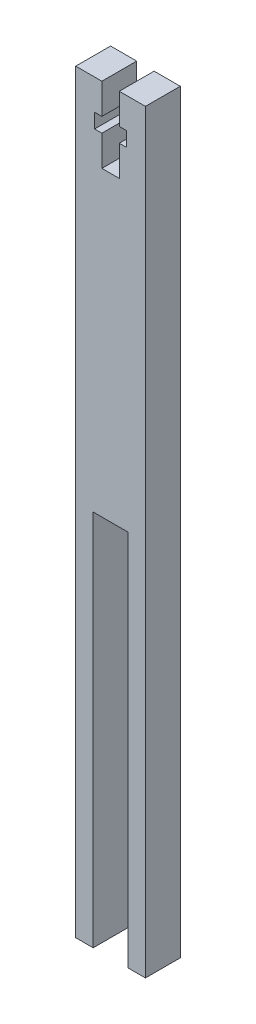
ISO-10303-21;
HEADER;
FILE_DESCRIPTION(('STEP AP214'),'2;1');
FILE_NAME('part.step','',(''),(''),'','','');
FILE_SCHEMA(('AUTOMOTIVE_DESIGN { 1 0 10303 214 1 1 1 1 }'));
ENDSEC;
DATA;
#1=APPLICATION_CONTEXT('core data for automotive mechanical design processes');
#2=APPLICATION_PROTOCOL_DEFINITION('international standard','automotive_design',2000,#1);
#3=PRODUCT_CONTEXT('',#1,'mechanical');
#4=PRODUCT('Part','Part','',(#3));
#5=PRODUCT_RELATED_PRODUCT_CATEGORY('part','',(#4));
#6=PRODUCT_DEFINITION_FORMATION('','',#4);
#7=PRODUCT_DEFINITION_CONTEXT('part definition',#1,'design');
#8=PRODUCT_DEFINITION('design','',#6,#7);
#9=PRODUCT_DEFINITION_SHAPE('','',#8);
#10=(LENGTH_UNIT() NAMED_UNIT(*) SI_UNIT(.MILLI.,.METRE.));
#11=(NAMED_UNIT(*) PLANE_ANGLE_UNIT() SI_UNIT($,.RADIAN.));
#12=(NAMED_UNIT(*) SI_UNIT($,.STERADIAN.) SOLID_ANGLE_UNIT());
#13=UNCERTAINTY_MEASURE_WITH_UNIT(LENGTH_MEASURE(1.E-05),#10,'distance_accuracy_value','');
#14=(GEOMETRIC_REPRESENTATION_CONTEXT(3) GLOBAL_UNCERTAINTY_ASSIGNED_CONTEXT((#13)) GLOBAL_UNIT_ASSIGNED_CONTEXT((#10,
#11,#12)) REPRESENTATION_CONTEXT('',''));
#15=CARTESIAN_POINT('',(0.,0.,0.));
#16=DIRECTION('',(0.,0.,1.));
#17=DIRECTION('',(1.,0.,0.));
#18=AXIS2_PLACEMENT_3D('',#15,#16,#17);
#19=CARTESIAN_POINT('',(-1.5,130.,6.));
#20=DIRECTION('',(0.,-1.,0.));
#21=DIRECTION('',(1.,0.,0.));
#22=AXIS2_PLACEMENT_3D('',#19,#20,#21);
#23=PLANE('',#22);
#24=DIRECTION('',(-1.,0.,0.));
#25=VECTOR('',#24,1.);
#26=CARTESIAN_POINT('',(-1.5,130.,0.));
#27=LINE('',#26,#25);
#28=CARTESIAN_POINT('',(-1.5,130.,0.));
#29=VERTEX_POINT('',#28);
#30=CARTESIAN_POINT('',(-6.00000000000001,130.,0.));
#31=VERTEX_POINT('',#30);
#32=EDGE_CURVE('E212',#29,#31,#27,.T.);
#33=ORIENTED_EDGE('',*,*,#32,.T.);
#34=DIRECTION('',(0.,0.,-1.));
#35=VECTOR('',#34,1.);
#36=CARTESIAN_POINT('',(-6.00000000000001,130.,6.));
#37=LINE('',#36,#35);
#38=CARTESIAN_POINT('',(-6.00000000000001,130.,6.));
#39=VERTEX_POINT('',#38);
#40=EDGE_CURVE('E11',#39,#31,#37,.T.);
#41=ORIENTED_EDGE('',*,*,#40,.F.);
#42=DIRECTION('',(-1.,0.,0.));
#43=VECTOR('',#42,1.);
#44=CARTESIAN_POINT('',(-1.5,130.,6.));
#45=LINE('',#44,#43);
#46=CARTESIAN_POINT('',(-1.5,130.,6.));
#47=VERTEX_POINT('',#46);
#48=EDGE_CURVE('E270',#47,#39,#45,.T.);
#49=ORIENTED_EDGE('',*,*,#48,.F.);
#50=DIRECTION('',(0.,0.,-1.));
#51=VECTOR('',#50,1.);
#52=CARTESIAN_POINT('',(-1.5,130.,6.));
#53=LINE('',#52,#51);
#54=EDGE_CURVE('E208',#47,#29,#53,.T.);
#55=ORIENTED_EDGE('',*,*,#54,.T.);
#56=EDGE_LOOP('',(#33,#41,#49,#55));
#57=FACE_BOUND('',#56,.T.);
#58=ADVANCED_FACE('F39',(#57),#23,.F.);
#59=CARTESIAN_POINT('',(-6.00000000000001,130.,6.));
#60=DIRECTION('',(1.,0.,0.));
#61=DIRECTION('',(0.,1.,0.));
#62=AXIS2_PLACEMENT_3D('',#59,#60,#61);
#63=PLANE('',#62);
#64=DIRECTION('',(0.,-1.,0.));
#65=VECTOR('',#64,1.);
#66=CARTESIAN_POINT('',(-6.00000000000001,130.,0.));
#67=LINE('',#66,#65);
#68=CARTESIAN_POINT('',(-5.99999999999999,0.,0.));
#69=VERTEX_POINT('',#68);
#70=EDGE_CURVE('E216',#31,#69,#67,.T.);
#71=ORIENTED_EDGE('',*,*,#70,.T.);
#72=DIRECTION('',(0.,0.,-1.));
#73=VECTOR('',#72,1.);
#74=CARTESIAN_POINT('',(-5.99999999999999,0.,6.));
#75=LINE('',#74,#73);
#76=CARTESIAN_POINT('',(-5.99999999999999,0.,6.));
#77=VERTEX_POINT('',#76);
#78=EDGE_CURVE('E48',#77,#69,#75,.T.);
#79=ORIENTED_EDGE('',*,*,#78,.F.);
#80=DIRECTION('',(0.,-1.,0.));
#81=VECTOR('',#80,1.);
#82=CARTESIAN_POINT('',(-6.00000000000001,130.,6.));
#83=LINE('',#82,#81);
#84=EDGE_CURVE('E135',#39,#77,#83,.T.);
#85=ORIENTED_EDGE('',*,*,#84,.F.);
#86=ORIENTED_EDGE('',*,*,#40,.T.);
#87=EDGE_LOOP('',(#71,#79,#85,#86));
#88=FACE_BOUND('',#87,.T.);
#89=ADVANCED_FACE('F420',(#88),#63,.F.);
#90=CARTESIAN_POINT('',(-5.99999999999999,0.,6.));
#91=DIRECTION('',(0.,1.,0.));
#92=DIRECTION('',(0.,0.,1.));
#93=AXIS2_PLACEMENT_3D('',#90,#91,#92);
#94=PLANE('',#93);
#95=DIRECTION('',(1.,0.,0.));
#96=VECTOR('',#95,1.);
#97=CARTESIAN_POINT('',(-5.99999999999999,0.,0.));
#98=LINE('',#97,#96);
#99=CARTESIAN_POINT('',(-3.,0.,0.));
#100=VERTEX_POINT('',#99);
#101=EDGE_CURVE('E219',#69,#100,#98,.T.);
#102=ORIENTED_EDGE('',*,*,#101,.T.);
#103=DIRECTION('',(0.,0.,-1.));
#104=VECTOR('',#103,1.);
#105=CARTESIAN_POINT('',(-3.,0.,6.));
#106=LINE('',#105,#104);
#107=CARTESIAN_POINT('',(-3.,0.,6.));
#108=VERTEX_POINT('',#107);
#109=EDGE_CURVE('E329',#108,#100,#106,.T.);
#110=ORIENTED_EDGE('',*,*,#109,.F.);
#111=DIRECTION('',(1.,0.,0.));
#112=VECTOR('',#111,1.);
#113=CARTESIAN_POINT('',(-5.99999999999999,0.,6.));
#114=LINE('',#113,#112);
#115=EDGE_CURVE('E339',#77,#108,#114,.T.);
#116=ORIENTED_EDGE('',*,*,#115,.F.);
#117=ORIENTED_EDGE('',*,*,#78,.T.);
#118=EDGE_LOOP('',(#102,#110,#116,#117));
#119=FACE_BOUND('',#118,.T.);
#120=ADVANCED_FACE('F337',(#119),#94,.F.);
#121=CARTESIAN_POINT('',(-3.,0.,6.));
#122=DIRECTION('',(-1.,0.,0.));
#123=DIRECTION('',(0.,0.,1.));
#124=AXIS2_PLACEMENT_3D('',#121,#122,#123);
#125=PLANE('',#124);
#126=DIRECTION('',(0.,1.,0.));
#127=VECTOR('',#126,1.);
#128=CARTESIAN_POINT('',(-3.,0.,0.));
#129=LINE('',#128,#127);
#130=CARTESIAN_POINT('',(-3.,65.,0.));
#131=VERTEX_POINT('',#130);
#132=EDGE_CURVE('E222',#100,#131,#129,.T.);
#133=ORIENTED_EDGE('',*,*,#132,.T.);
#134=DIRECTION('',(0.,0.,-1.));
#135=VECTOR('',#134,1.);
#136=CARTESIAN_POINT('',(-3.,65.,6.));
#137=LINE('',#136,#135);
#138=CARTESIAN_POINT('',(-3.,65.,6.));
#139=VERTEX_POINT('',#138);
#140=EDGE_CURVE('E325',#139,#131,#137,.T.);
#141=ORIENTED_EDGE('',*,*,#140,.F.);
#142=DIRECTION('',(0.,1.,0.));
#143=VECTOR('',#142,1.);
#144=CARTESIAN_POINT('',(-3.,0.,6.));
#145=LINE('',#144,#143);
#146=EDGE_CURVE('E358',#108,#139,#145,.T.);
#147=ORIENTED_EDGE('',*,*,#146,.F.);
#148=ORIENTED_EDGE('',*,*,#109,.T.);
#149=EDGE_LOOP('',(#133,#141,#147,#148));
#150=FACE_BOUND('',#149,.T.);
#151=ADVANCED_FACE('F348',(#150),#125,.F.);
#152=CARTESIAN_POINT('',(-3.,65.,6.));
#153=DIRECTION('',(0.,1.,0.));
#154=DIRECTION('',(0.,0.,1.));
#155=AXIS2_PLACEMENT_3D('',#152,#153,#154);
#156=PLANE('',#155);
#157=DIRECTION('',(1.,0.,0.));
#158=VECTOR('',#157,1.);
#159=CARTESIAN_POINT('',(-3.,65.,0.));
#160=LINE('',#159,#158);
#161=CARTESIAN_POINT('',(3.,65.,0.));
#162=VERTEX_POINT('',#161);
#163=EDGE_CURVE('E225',#131,#162,#160,.T.);
#164=ORIENTED_EDGE('',*,*,#163,.T.);
#165=DIRECTION('',(0.,0.,-1.));
#166=VECTOR('',#165,1.);
#167=CARTESIAN_POINT('',(3.,65.,6.));
#168=LINE('',#167,#166);
#169=CARTESIAN_POINT('',(3.,65.,6.));
#170=VERTEX_POINT('',#169);
#171=EDGE_CURVE('E321',#170,#162,#168,.T.);
#172=ORIENTED_EDGE('',*,*,#171,.F.);
#173=DIRECTION('',(1.,0.,0.));
#174=VECTOR('',#173,1.);
#175=CARTESIAN_POINT('',(-3.,65.,6.));
#176=LINE('',#175,#174);
#177=EDGE_CURVE('E354',#139,#170,#176,.T.);
#178=ORIENTED_EDGE('',*,*,#177,.F.);
#179=ORIENTED_EDGE('',*,*,#140,.T.);
#180=EDGE_LOOP('',(#164,#172,#178,#179));
#181=FACE_BOUND('',#180,.T.);
#182=ADVANCED_FACE('F352',(#181),#156,.F.);
#183=CARTESIAN_POINT('',(3.,0.,6.));
#184=DIRECTION('',(1.,0.,0.));
#185=DIRECTION('',(0.,0.,-1.));
#186=AXIS2_PLACEMENT_3D('',#183,#184,#185);
#187=PLANE('',#186);
#188=DIRECTION('',(0.,-1.,0.));
#189=VECTOR('',#188,1.);
#190=CARTESIAN_POINT('',(3.,0.,0.));
#191=LINE('',#190,#189);
#192=CARTESIAN_POINT('',(3.,0.,0.));
#193=VERTEX_POINT('',#192);
#194=EDGE_CURVE('E228',#162,#193,#191,.T.);
#195=ORIENTED_EDGE('',*,*,#194,.T.);
#196=DIRECTION('',(0.,0.,-1.));
#197=VECTOR('',#196,1.);
#198=CARTESIAN_POINT('',(3.,0.,6.));
#199=LINE('',#198,#197);
#200=CARTESIAN_POINT('',(3.,0.,6.));
#201=VERTEX_POINT('',#200);
#202=EDGE_CURVE('E317',#201,#193,#199,.T.);
#203=ORIENTED_EDGE('',*,*,#202,.F.);
#204=DIRECTION('',(0.,-1.,0.));
#205=VECTOR('',#204,1.);
#206=CARTESIAN_POINT('',(3.,0.,6.));
#207=LINE('',#206,#205);
#208=EDGE_CURVE('E357',#170,#201,#207,.T.);
#209=ORIENTED_EDGE('',*,*,#208,.F.);
#210=ORIENTED_EDGE('',*,*,#171,.T.);
#211=EDGE_LOOP('',(#195,#203,#209,#210));
#212=FACE_BOUND('',#211,.T.);
#213=ADVANCED_FACE('F433',(#212),#187,.F.);
#214=CARTESIAN_POINT('',(5.99999999999999,0.,6.));
#215=DIRECTION('',(0.,1.,0.));
#216=DIRECTION('',(0.,0.,1.));
#217=AXIS2_PLACEMENT_3D('',#214,#215,#216);
#218=PLANE('',#217);
#219=DIRECTION('',(1.,0.,0.));
#220=VECTOR('',#219,1.);
#221=CARTESIAN_POINT('',(5.99999999999999,0.,0.));
#222=LINE('',#221,#220);
#223=CARTESIAN_POINT('',(5.99999999999999,0.,0.));
#224=VERTEX_POINT('',#223);
#225=EDGE_CURVE('E231',#193,#224,#222,.T.);
#226=ORIENTED_EDGE('',*,*,#225,.T.);
#227=DIRECTION('',(0.,0.,-1.));
#228=VECTOR('',#227,1.);
#229=CARTESIAN_POINT('',(5.99999999999999,0.,6.));
#230=LINE('',#229,#228);
#231=CARTESIAN_POINT('',(5.99999999999999,0.,6.));
#232=VERTEX_POINT('',#231);
#233=EDGE_CURVE('E313',#232,#224,#230,.T.);
#234=ORIENTED_EDGE('',*,*,#233,.F.);
#235=DIRECTION('',(1.,0.,0.));
#236=VECTOR('',#235,1.);
#237=CARTESIAN_POINT('',(5.99999999999999,0.,6.));
#238=LINE('',#237,#236);
#239=EDGE_CURVE('E362',#201,#232,#238,.T.);
#240=ORIENTED_EDGE('',*,*,#239,.F.);
#241=ORIENTED_EDGE('',*,*,#202,.T.);
#242=EDGE_LOOP('',(#226,#234,#240,#241));
#243=FACE_BOUND('',#242,.T.);
#244=ADVANCED_FACE('F436',(#243),#218,.F.);
#245=CARTESIAN_POINT('',(6.00000000000001,130.,6.));
#246=DIRECTION('',(-1.,0.,0.));
#247=DIRECTION('',(0.,-1.,0.));
#248=AXIS2_PLACEMENT_3D('',#245,#246,#247);
#249=PLANE('',#248);
#250=DIRECTION('',(0.,1.,0.));
#251=VECTOR('',#250,1.);
#252=CARTESIAN_POINT('',(6.00000000000001,130.,0.));
#253=LINE('',#252,#251);
#254=CARTESIAN_POINT('',(6.00000000000001,130.,0.));
#255=VERTEX_POINT('',#254);
#256=EDGE_CURVE('E234',#224,#255,#253,.T.);
#257=ORIENTED_EDGE('',*,*,#256,.T.);
#258=DIRECTION('',(0.,0.,-1.));
#259=VECTOR('',#258,1.);
#260=CARTESIAN_POINT('',(6.00000000000001,130.,6.));
#261=LINE('',#260,#259);
#262=CARTESIAN_POINT('',(6.00000000000001,130.,6.));
#263=VERTEX_POINT('',#262);
#264=EDGE_CURVE('E309',#263,#255,#261,.T.);
#265=ORIENTED_EDGE('',*,*,#264,.F.);
#266=DIRECTION('',(0.,1.,0.));
#267=VECTOR('',#266,1.);
#268=CARTESIAN_POINT('',(6.00000000000001,130.,6.));
#269=LINE('',#268,#267);
#270=EDGE_CURVE('E369',#232,#263,#269,.T.);
#271=ORIENTED_EDGE('',*,*,#270,.F.);
#272=ORIENTED_EDGE('',*,*,#233,.T.);
#273=EDGE_LOOP('',(#257,#265,#271,#272));
#274=FACE_BOUND('',#273,.T.);
#275=ADVANCED_FACE('F440',(#274),#249,.F.);
#276=CARTESIAN_POINT('',(1.5,130.,6.));
#277=DIRECTION('',(0.,-1.,0.));
#278=DIRECTION('',(1.,0.,0.));
#279=AXIS2_PLACEMENT_3D('',#276,#277,#278);
#280=PLANE('',#279);
#281=DIRECTION('',(-1.,0.,0.));
#282=VECTOR('',#281,1.);
#283=CARTESIAN_POINT('',(1.5,130.,0.));
#284=LINE('',#283,#282);
#285=CARTESIAN_POINT('',(1.5,130.,0.));
#286=VERTEX_POINT('',#285);
#287=EDGE_CURVE('E237',#255,#286,#284,.T.);
#288=ORIENTED_EDGE('',*,*,#287,.T.);
#289=DIRECTION('',(0.,0.,-1.));
#290=VECTOR('',#289,1.);
#291=CARTESIAN_POINT('',(1.5,130.,6.));
#292=LINE('',#291,#290);
#293=CARTESIAN_POINT('',(1.5,130.,6.));
#294=VERTEX_POINT('',#293);
#295=EDGE_CURVE('E305',#294,#286,#292,.T.);
#296=ORIENTED_EDGE('',*,*,#295,.F.);
#297=DIRECTION('',(-1.,0.,0.));
#298=VECTOR('',#297,1.);
#299=CARTESIAN_POINT('',(1.5,130.,6.));
#300=LINE('',#299,#298);
#301=EDGE_CURVE('E372',#263,#294,#300,.T.);
#302=ORIENTED_EDGE('',*,*,#301,.F.);
#303=ORIENTED_EDGE('',*,*,#264,.T.);
#304=EDGE_LOOP('',(#288,#296,#302,#303));
#305=FACE_BOUND('',#304,.T.);
#306=ADVANCED_FACE('F444',(#305),#280,.F.);
#307=CARTESIAN_POINT('',(1.5,130.,6.));
#308=DIRECTION('',(1.,0.,0.));
#309=DIRECTION('',(0.,1.,0.));
#310=AXIS2_PLACEMENT_3D('',#307,#308,#309);
#311=PLANE('',#310);
#312=DIRECTION('',(0.,-1.,0.));
#313=VECTOR('',#312,1.);
#314=CARTESIAN_POINT('',(1.5,130.,0.));
#315=LINE('',#314,#313);
#316=CARTESIAN_POINT('',(1.5,124.75,0.));
#317=VERTEX_POINT('',#316);
#318=EDGE_CURVE('E240',#286,#317,#315,.T.);
#319=ORIENTED_EDGE('',*,*,#318,.T.);
#320=DIRECTION('',(0.,0.,-1.));
#321=VECTOR('',#320,1.);
#322=CARTESIAN_POINT('',(1.5,124.75,6.));
#323=LINE('',#322,#321);
#324=CARTESIAN_POINT('',(1.5,124.75,6.));
#325=VERTEX_POINT('',#324);
#326=EDGE_CURVE('E301',#325,#317,#323,.T.);
#327=ORIENTED_EDGE('',*,*,#326,.F.);
#328=DIRECTION('',(0.,-1.,0.));
#329=VECTOR('',#328,1.);
#330=CARTESIAN_POINT('',(1.5,130.,6.));
#331=LINE('',#330,#329);
#332=EDGE_CURVE('E375',#294,#325,#331,.T.);
#333=ORIENTED_EDGE('',*,*,#332,.F.);
#334=ORIENTED_EDGE('',*,*,#295,.T.);
#335=EDGE_LOOP('',(#319,#327,#333,#334));
#336=FACE_BOUND('',#335,.T.);
#337=ADVANCED_FACE('F448',(#336),#311,.F.);
#338=CARTESIAN_POINT('',(1.5,124.75,6.));
#339=DIRECTION('',(0.,1.,0.));
#340=DIRECTION('',(0.,0.,1.));
#341=AXIS2_PLACEMENT_3D('',#338,#339,#340);
#342=PLANE('',#341);
#343=DIRECTION('',(1.,0.,0.));
#344=VECTOR('',#343,1.);
#345=CARTESIAN_POINT('',(1.5,124.75,0.));
#346=LINE('',#345,#344);
#347=CARTESIAN_POINT('',(2.75,124.75,0.));
#348=VERTEX_POINT('',#347);
#349=EDGE_CURVE('E243',#317,#348,#346,.T.);
#350=ORIENTED_EDGE('',*,*,#349,.T.);
#351=DIRECTION('',(0.,0.,-1.));
#352=VECTOR('',#351,1.);
#353=CARTESIAN_POINT('',(2.75,124.75,6.));
#354=LINE('',#353,#352);
#355=CARTESIAN_POINT('',(2.75,124.75,6.));
#356=VERTEX_POINT('',#355);
#357=EDGE_CURVE('E297',#356,#348,#354,.T.);
#358=ORIENTED_EDGE('',*,*,#357,.F.);
#359=DIRECTION('',(1.,0.,0.));
#360=VECTOR('',#359,1.);
#361=CARTESIAN_POINT('',(1.5,124.75,6.));
#362=LINE('',#361,#360);
#363=EDGE_CURVE('E378',#325,#356,#362,.T.);
#364=ORIENTED_EDGE('',*,*,#363,.F.);
#365=ORIENTED_EDGE('',*,*,#326,.T.);
#366=EDGE_LOOP('',(#350,#358,#364,#365));
#367=FACE_BOUND('',#366,.T.);
#368=ADVANCED_FACE('F452',(#367),#342,.F.);
#369=CARTESIAN_POINT('',(2.75,124.75,6.));
#370=DIRECTION('',(1.,0.,0.));
#371=DIRECTION('',(0.,0.,-1.));
#372=AXIS2_PLACEMENT_3D('',#369,#370,#371);
#373=PLANE('',#372);
#374=DIRECTION('',(0.,-1.,0.));
#375=VECTOR('',#374,1.);
#376=CARTESIAN_POINT('',(2.75,124.75,0.));
#377=LINE('',#376,#375);
#378=CARTESIAN_POINT('',(2.75,122.25,0.));
#379=VERTEX_POINT('',#378);
#380=EDGE_CURVE('E246',#348,#379,#377,.T.);
#381=ORIENTED_EDGE('',*,*,#380,.T.);
#382=DIRECTION('',(0.,0.,-1.));
#383=VECTOR('',#382,1.);
#384=CARTESIAN_POINT('',(2.75,122.25,6.));
#385=LINE('',#384,#383);
#386=CARTESIAN_POINT('',(2.75,122.25,6.));
#387=VERTEX_POINT('',#386);
#388=EDGE_CURVE('E293',#387,#379,#385,.T.);
#389=ORIENTED_EDGE('',*,*,#388,.F.);
#390=DIRECTION('',(0.,-1.,0.));
#391=VECTOR('',#390,1.);
#392=CARTESIAN_POINT('',(2.75,124.75,6.));
#393=LINE('',#392,#391);
#394=EDGE_CURVE('E381',#356,#387,#393,.T.);
#395=ORIENTED_EDGE('',*,*,#394,.F.);
#396=ORIENTED_EDGE('',*,*,#357,.T.);
#397=EDGE_LOOP('',(#381,#389,#395,#396));
#398=FACE_BOUND('',#397,.T.);
#399=ADVANCED_FACE('F456',(#398),#373,.F.);
#400=CARTESIAN_POINT('',(2.75,122.25,6.));
#401=DIRECTION('',(0.,-1.,0.));
#402=DIRECTION('',(0.,0.,-1.));
#403=AXIS2_PLACEMENT_3D('',#400,#401,#402);
#404=PLANE('',#403);
#405=DIRECTION('',(-1.,0.,0.));
#406=VECTOR('',#405,1.);
#407=CARTESIAN_POINT('',(2.75,122.25,0.));
#408=LINE('',#407,#406);
#409=CARTESIAN_POINT('',(1.5,122.25,0.));
#410=VERTEX_POINT('',#409);
#411=EDGE_CURVE('E249',#379,#410,#408,.T.);
#412=ORIENTED_EDGE('',*,*,#411,.T.);
#413=DIRECTION('',(0.,0.,-1.));
#414=VECTOR('',#413,1.);
#415=CARTESIAN_POINT('',(1.5,122.25,6.));
#416=LINE('',#415,#414);
#417=CARTESIAN_POINT('',(1.5,122.25,6.));
#418=VERTEX_POINT('',#417);
#419=EDGE_CURVE('E289',#418,#410,#416,.T.);
#420=ORIENTED_EDGE('',*,*,#419,.F.);
#421=DIRECTION('',(-1.,0.,0.));
#422=VECTOR('',#421,1.);
#423=CARTESIAN_POINT('',(2.75,122.25,6.));
#424=LINE('',#423,#422);
#425=EDGE_CURVE('E384',#387,#418,#424,.T.);
#426=ORIENTED_EDGE('',*,*,#425,.F.);
#427=ORIENTED_EDGE('',*,*,#388,.T.);
#428=EDGE_LOOP('',(#412,#420,#426,#427));
#429=FACE_BOUND('',#428,.T.);
#430=ADVANCED_FACE('F460',(#429),#404,.F.);
#431=CARTESIAN_POINT('',(1.5,122.25,6.));
#432=DIRECTION('',(1.,0.,0.));
#433=DIRECTION('',(0.,1.,0.));
#434=AXIS2_PLACEMENT_3D('',#431,#432,#433);
#435=PLANE('',#434);
#436=DIRECTION('',(0.,-1.,0.));
#437=VECTOR('',#436,1.);
#438=CARTESIAN_POINT('',(1.5,122.25,0.));
#439=LINE('',#438,#437);
#440=CARTESIAN_POINT('',(1.5,117.,0.));
#441=VERTEX_POINT('',#440);
#442=EDGE_CURVE('E252',#410,#441,#439,.T.);
#443=ORIENTED_EDGE('',*,*,#442,.T.);
#444=DIRECTION('',(0.,0.,-1.));
#445=VECTOR('',#444,1.);
#446=CARTESIAN_POINT('',(1.5,117.,6.));
#447=LINE('',#446,#445);
#448=CARTESIAN_POINT('',(1.5,117.,6.));
#449=VERTEX_POINT('',#448);
#450=EDGE_CURVE('E285',#449,#441,#447,.T.);
#451=ORIENTED_EDGE('',*,*,#450,.F.);
#452=DIRECTION('',(0.,-1.,0.));
#453=VECTOR('',#452,1.);
#454=CARTESIAN_POINT('',(1.5,122.25,6.));
#455=LINE('',#454,#453);
#456=EDGE_CURVE('E387',#418,#449,#455,.T.);
#457=ORIENTED_EDGE('',*,*,#456,.F.);
#458=ORIENTED_EDGE('',*,*,#419,.T.);
#459=EDGE_LOOP('',(#443,#451,#457,#458));
#460=FACE_BOUND('',#459,.T.);
#461=ADVANCED_FACE('F464',(#460),#435,.F.);
#462=CARTESIAN_POINT('',(-1.5,117.,6.));
#463=DIRECTION('',(0.,-1.,0.));
#464=DIRECTION('',(1.,0.,0.));
#465=AXIS2_PLACEMENT_3D('',#462,#463,#464);
#466=PLANE('',#465);
#467=DIRECTION('',(-1.,0.,0.));
#468=VECTOR('',#467,1.);
#469=CARTESIAN_POINT('',(-1.5,117.,0.));
#470=LINE('',#469,#468);
#471=CARTESIAN_POINT('',(-1.5,117.,0.));
#472=VERTEX_POINT('',#471);
#473=EDGE_CURVE('E255',#441,#472,#470,.T.);
#474=ORIENTED_EDGE('',*,*,#473,.T.);
#475=DIRECTION('',(0.,0.,-1.));
#476=VECTOR('',#475,1.);
#477=CARTESIAN_POINT('',(-1.5,117.,6.));
#478=LINE('',#477,#476);
#479=CARTESIAN_POINT('',(-1.5,117.,6.));
#480=VERTEX_POINT('',#479);
#481=EDGE_CURVE('E281',#480,#472,#478,.T.);
#482=ORIENTED_EDGE('',*,*,#481,.F.);
#483=DIRECTION('',(-1.,0.,0.));
#484=VECTOR('',#483,1.);
#485=CARTESIAN_POINT('',(-1.5,117.,6.));
#486=LINE('',#485,#484);
#487=EDGE_CURVE('E390',#449,#480,#486,.T.);
#488=ORIENTED_EDGE('',*,*,#487,.F.);
#489=ORIENTED_EDGE('',*,*,#450,.T.);
#490=EDGE_LOOP('',(#474,#482,#488,#489));
#491=FACE_BOUND('',#490,.T.);
#492=ADVANCED_FACE('F468',(#491),#466,.F.);
#493=CARTESIAN_POINT('',(-1.5,122.25,6.));
#494=DIRECTION('',(-1.,0.,0.));
#495=DIRECTION('',(0.,-1.,0.));
#496=AXIS2_PLACEMENT_3D('',#493,#494,#495);
#497=PLANE('',#496);
#498=DIRECTION('',(0.,1.,0.));
#499=VECTOR('',#498,1.);
#500=CARTESIAN_POINT('',(-1.5,122.25,0.));
#501=LINE('',#500,#499);
#502=CARTESIAN_POINT('',(-1.5,122.25,0.));
#503=VERTEX_POINT('',#502);
#504=EDGE_CURVE('E258',#472,#503,#501,.T.);
#505=ORIENTED_EDGE('',*,*,#504,.T.);
#506=DIRECTION('',(0.,0.,-1.));
#507=VECTOR('',#506,1.);
#508=CARTESIAN_POINT('',(-1.5,122.25,6.));
#509=LINE('',#508,#507);
#510=CARTESIAN_POINT('',(-1.5,122.25,6.));
#511=VERTEX_POINT('',#510);
#512=EDGE_CURVE('E277',#511,#503,#509,.T.);
#513=ORIENTED_EDGE('',*,*,#512,.F.);
#514=DIRECTION('',(0.,1.,0.));
#515=VECTOR('',#514,1.);
#516=CARTESIAN_POINT('',(-1.5,122.25,6.));
#517=LINE('',#516,#515);
#518=EDGE_CURVE('E393',#480,#511,#517,.T.);
#519=ORIENTED_EDGE('',*,*,#518,.F.);
#520=ORIENTED_EDGE('',*,*,#481,.T.);
#521=EDGE_LOOP('',(#505,#513,#519,#520));
#522=FACE_BOUND('',#521,.T.);
#523=ADVANCED_FACE('F401',(#522),#497,.F.);
#524=CARTESIAN_POINT('',(-2.75,122.25,6.));
#525=DIRECTION('',(0.,-1.,0.));
#526=DIRECTION('',(0.,0.,-1.));
#527=AXIS2_PLACEMENT_3D('',#524,#525,#526);
#528=PLANE('',#527);
#529=DIRECTION('',(-1.,0.,0.));
#530=VECTOR('',#529,1.);
#531=CARTESIAN_POINT('',(-2.75,122.25,0.));
#532=LINE('',#531,#530);
#533=CARTESIAN_POINT('',(-2.75,122.25,0.));
#534=VERTEX_POINT('',#533);
#535=EDGE_CURVE('E261',#503,#534,#532,.T.);
#536=ORIENTED_EDGE('',*,*,#535,.T.);
#537=DIRECTION('',(0.,0.,-1.));
#538=VECTOR('',#537,1.);
#539=CARTESIAN_POINT('',(-2.75,122.25,6.));
#540=LINE('',#539,#538);
#541=CARTESIAN_POINT('',(-2.75,122.25,6.));
#542=VERTEX_POINT('',#541);
#543=EDGE_CURVE('E201',#542,#534,#540,.T.);
#544=ORIENTED_EDGE('',*,*,#543,.F.);
#545=DIRECTION('',(-1.,0.,0.));
#546=VECTOR('',#545,1.);
#547=CARTESIAN_POINT('',(-2.75,122.25,6.));
#548=LINE('',#547,#546);
#549=EDGE_CURVE('E190',#511,#542,#548,.T.);
#550=ORIENTED_EDGE('',*,*,#549,.F.);
#551=ORIENTED_EDGE('',*,*,#512,.T.);
#552=EDGE_LOOP('',(#536,#544,#550,#551));
#553=FACE_BOUND('',#552,.T.);
#554=ADVANCED_FACE('F405',(#553),#528,.F.);
#555=CARTESIAN_POINT('',(-2.75,124.75,6.));
#556=DIRECTION('',(-1.,0.,0.));
#557=DIRECTION('',(0.,0.,1.));
#558=AXIS2_PLACEMENT_3D('',#555,#556,#557);
#559=PLANE('',#558);
#560=DIRECTION('',(0.,1.,0.));
#561=VECTOR('',#560,1.);
#562=CARTESIAN_POINT('',(-2.75,124.75,0.));
#563=LINE('',#562,#561);
#564=CARTESIAN_POINT('',(-2.75,124.75,0.));
#565=VERTEX_POINT('',#564);
#566=EDGE_CURVE('E199',#534,#565,#563,.T.);
#567=ORIENTED_EDGE('',*,*,#566,.T.);
#568=DIRECTION('',(0.,0.,-1.));
#569=VECTOR('',#568,1.);
#570=CARTESIAN_POINT('',(-2.75,124.75,6.));
#571=LINE('',#570,#569);
#572=CARTESIAN_POINT('',(-2.75,124.75,6.));
#573=VERTEX_POINT('',#572);
#574=EDGE_CURVE('E196',#573,#565,#571,.T.);
#575=ORIENTED_EDGE('',*,*,#574,.F.);
#576=DIRECTION('',(0.,1.,0.));
#577=VECTOR('',#576,1.);
#578=CARTESIAN_POINT('',(-2.75,124.75,6.));
#579=LINE('',#578,#577);
#580=EDGE_CURVE('E184',#542,#573,#579,.T.);
#581=ORIENTED_EDGE('',*,*,#580,.F.);
#582=ORIENTED_EDGE('',*,*,#543,.T.);
#583=EDGE_LOOP('',(#567,#575,#581,#582));
#584=FACE_BOUND('',#583,.T.);
#585=ADVANCED_FACE('F197',(#584),#559,.F.);
#586=CARTESIAN_POINT('',(-1.5,124.75,6.));
#587=DIRECTION('',(0.,1.,0.));
#588=DIRECTION('',(0.,0.,1.));
#589=AXIS2_PLACEMENT_3D('',#586,#587,#588);
#590=PLANE('',#589);
#591=DIRECTION('',(1.,0.,0.));
#592=VECTOR('',#591,1.);
#593=CARTESIAN_POINT('',(-1.5,124.75,0.));
#594=LINE('',#593,#592);
#595=CARTESIAN_POINT('',(-1.5,124.75,0.));
#596=VERTEX_POINT('',#595);
#597=EDGE_CURVE('E121',#565,#596,#594,.T.);
#598=ORIENTED_EDGE('',*,*,#597,.T.);
#599=DIRECTION('',(0.,0.,-1.));
#600=VECTOR('',#599,1.);
#601=CARTESIAN_POINT('',(-1.5,124.75,6.));
#602=LINE('',#601,#600);
#603=CARTESIAN_POINT('',(-1.5,124.75,6.));
#604=VERTEX_POINT('',#603);
#605=EDGE_CURVE('E202',#604,#596,#602,.T.);
#606=ORIENTED_EDGE('',*,*,#605,.F.);
#607=DIRECTION('',(1.,0.,0.));
#608=VECTOR('',#607,1.);
#609=CARTESIAN_POINT('',(-1.5,124.75,6.));
#610=LINE('',#609,#608);
#611=EDGE_CURVE('E188',#573,#604,#610,.T.);
#612=ORIENTED_EDGE('',*,*,#611,.F.);
#613=ORIENTED_EDGE('',*,*,#574,.T.);
#614=EDGE_LOOP('',(#598,#606,#612,#613));
#615=FACE_BOUND('',#614,.T.);
#616=ADVANCED_FACE('F204',(#615),#590,.F.);
#617=CARTESIAN_POINT('',(-1.5,130.,6.));
#618=DIRECTION('',(-1.,0.,0.));
#619=DIRECTION('',(0.,-1.,0.));
#620=AXIS2_PLACEMENT_3D('',#617,#618,#619);
#621=PLANE('',#620);
#622=DIRECTION('',(0.,1.,0.));
#623=VECTOR('',#622,1.);
#624=CARTESIAN_POINT('',(-1.5,130.,0.));
#625=LINE('',#624,#623);
#626=EDGE_CURVE('E127',#596,#29,#625,.T.);
#627=ORIENTED_EDGE('',*,*,#626,.T.);
#628=ORIENTED_EDGE('',*,*,#54,.F.);
#629=DIRECTION('',(0.,1.,0.));
#630=VECTOR('',#629,1.);
#631=CARTESIAN_POINT('',(-1.5,130.,6.));
#632=LINE('',#631,#630);
#633=EDGE_CURVE('E56',#604,#47,#632,.T.);
#634=ORIENTED_EDGE('',*,*,#633,.F.);
#635=ORIENTED_EDGE('',*,*,#605,.T.);
#636=EDGE_LOOP('',(#627,#628,#634,#635));
#637=FACE_BOUND('',#636,.T.);
#638=ADVANCED_FACE('F409',(#637),#621,.F.);
#639=CARTESIAN_POINT('',(0.,0.,6.));
#640=DIRECTION('',(0.,0.,1.));
#641=DIRECTION('',(1.,0.,0.));
#642=AXIS2_PLACEMENT_3D('',#639,#640,#641);
#643=PLANE('',#642);
#644=ORIENTED_EDGE('',*,*,#48,.T.);
#645=ORIENTED_EDGE('',*,*,#84,.T.);
#646=ORIENTED_EDGE('',*,*,#115,.T.);
#647=ORIENTED_EDGE('',*,*,#146,.T.);
#648=ORIENTED_EDGE('',*,*,#177,.T.);
#649=ORIENTED_EDGE('',*,*,#208,.T.);
#650=ORIENTED_EDGE('',*,*,#239,.T.);
#651=ORIENTED_EDGE('',*,*,#270,.T.);
#652=ORIENTED_EDGE('',*,*,#301,.T.);
#653=ORIENTED_EDGE('',*,*,#332,.T.);
#654=ORIENTED_EDGE('',*,*,#363,.T.);
#655=ORIENTED_EDGE('',*,*,#394,.T.);
#656=ORIENTED_EDGE('',*,*,#425,.T.);
#657=ORIENTED_EDGE('',*,*,#456,.T.);
#658=ORIENTED_EDGE('',*,*,#487,.T.);
#659=ORIENTED_EDGE('',*,*,#518,.T.);
#660=ORIENTED_EDGE('',*,*,#549,.T.);
#661=ORIENTED_EDGE('',*,*,#580,.T.);
#662=ORIENTED_EDGE('',*,*,#611,.T.);
#663=ORIENTED_EDGE('',*,*,#633,.T.);
#664=EDGE_LOOP('',(#644,#645,#646,#647,#648,#649,#650,#651,#652,#653,#654,#655,#656,#657,#658,
#659,#660,#661,#662,#663));
#665=FACE_BOUND('',#664,.T.);
#666=ADVANCED_FACE('F186',(#665),#643,.T.);
#667=CARTESIAN_POINT('',(0.,0.,0.));
#668=DIRECTION('',(0.,0.,1.));
#669=DIRECTION('',(1.,0.,0.));
#670=AXIS2_PLACEMENT_3D('',#667,#668,#669);
#671=PLANE('',#670);
#672=ORIENTED_EDGE('',*,*,#32,.F.);
#673=ORIENTED_EDGE('',*,*,#626,.F.);
#674=ORIENTED_EDGE('',*,*,#597,.F.);
#675=ORIENTED_EDGE('',*,*,#566,.F.);
#676=ORIENTED_EDGE('',*,*,#535,.F.);
#677=ORIENTED_EDGE('',*,*,#504,.F.);
#678=ORIENTED_EDGE('',*,*,#473,.F.);
#679=ORIENTED_EDGE('',*,*,#442,.F.);
#680=ORIENTED_EDGE('',*,*,#411,.F.);
#681=ORIENTED_EDGE('',*,*,#380,.F.);
#682=ORIENTED_EDGE('',*,*,#349,.F.);
#683=ORIENTED_EDGE('',*,*,#318,.F.);
#684=ORIENTED_EDGE('',*,*,#287,.F.);
#685=ORIENTED_EDGE('',*,*,#256,.F.);
#686=ORIENTED_EDGE('',*,*,#225,.F.);
#687=ORIENTED_EDGE('',*,*,#194,.F.);
#688=ORIENTED_EDGE('',*,*,#163,.F.);
#689=ORIENTED_EDGE('',*,*,#132,.F.);
#690=ORIENTED_EDGE('',*,*,#101,.F.);
#691=ORIENTED_EDGE('',*,*,#70,.F.);
#692=EDGE_LOOP('',(#672,#673,#674,#675,#676,#677,#678,#679,#680,#681,#682,#683,#684,#685,#686,
#687,#688,#689,#690,#691));
#693=FACE_BOUND('',#692,.T.);
#694=ADVANCED_FACE('F343',(#693),#671,.F.);
#695=CLOSED_SHELL('',(#58,#89,#120,#151,#182,#213,#244,#275,#306,#337,#368,#399,#430,#461,#492,
#523,#554,#585,#616,#638,#666,#694));
#696=MANIFOLD_SOLID_BREP('B2',#695);
#697=ADVANCED_BREP_SHAPE_REPRESENTATION('',(#18,#696),#14);
#698=SHAPE_DEFINITION_REPRESENTATION(#9,#697);
ENDSEC;
END-ISO-10303-21;
